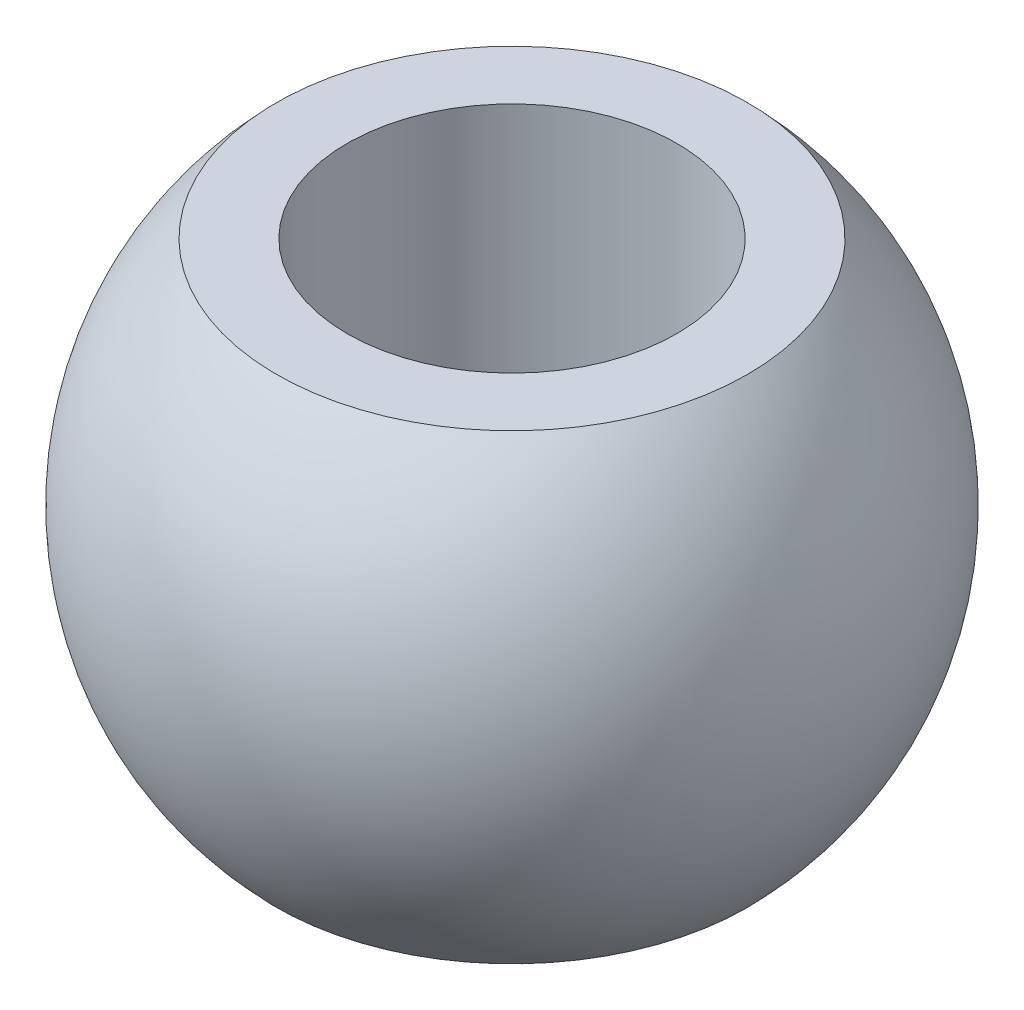
ISO-10303-21;
HEADER;
FILE_DESCRIPTION(('STEP AP214'),'2;1');
FILE_NAME('part.step','',(''),(''),'','','');
FILE_SCHEMA(('AUTOMOTIVE_DESIGN { 1 0 10303 214 1 1 1 1 }'));
ENDSEC;
DATA;
#1=APPLICATION_CONTEXT('core data for automotive mechanical design processes');
#2=APPLICATION_PROTOCOL_DEFINITION('international standard','automotive_design',2000,#1);
#3=PRODUCT_CONTEXT('',#1,'mechanical');
#4=PRODUCT('Part','Part','',(#3));
#5=PRODUCT_RELATED_PRODUCT_CATEGORY('part','',(#4));
#6=PRODUCT_DEFINITION_FORMATION('','',#4);
#7=PRODUCT_DEFINITION_CONTEXT('part definition',#1,'design');
#8=PRODUCT_DEFINITION('design','',#6,#7);
#9=PRODUCT_DEFINITION_SHAPE('','',#8);
#10=(LENGTH_UNIT() NAMED_UNIT(*) SI_UNIT(.MILLI.,.METRE.));
#11=(NAMED_UNIT(*) PLANE_ANGLE_UNIT() SI_UNIT($,.RADIAN.));
#12=(NAMED_UNIT(*) SI_UNIT($,.STERADIAN.) SOLID_ANGLE_UNIT());
#13=UNCERTAINTY_MEASURE_WITH_UNIT(LENGTH_MEASURE(1.E-05),#10,'distance_accuracy_value','');
#14=(GEOMETRIC_REPRESENTATION_CONTEXT(3) GLOBAL_UNCERTAINTY_ASSIGNED_CONTEXT((#13)) GLOBAL_UNIT_ASSIGNED_CONTEXT((#10,
#11,#12)) REPRESENTATION_CONTEXT('',''));
#15=CARTESIAN_POINT('',(0.,0.,0.));
#16=DIRECTION('',(0.,0.,1.));
#17=DIRECTION('',(1.,0.,0.));
#18=AXIS2_PLACEMENT_3D('',#15,#16,#17);
#19=CARTESIAN_POINT('',(5.,7.,0.));
#20=DIRECTION('',(0.,-1.,0.));
#21=DIRECTION('',(0.,0.,-1.));
#22=AXIS2_PLACEMENT_3D('',#19,#20,#21);
#23=PLANE('',#22);
#24=CARTESIAN_POINT('',(0.,7.,0.));
#25=DIRECTION('',(0.,1.,0.));
#26=DIRECTION('',(0.,0.,1.));
#27=AXIS2_PLACEMENT_3D('',#24,#25,#26);
#28=CIRCLE('',#27,5.);
#29=CARTESIAN_POINT('',(0.,7.,5.));
#30=VERTEX_POINT('',#29);
#31=EDGE_CURVE('E48',#30,#30,#28,.T.);
#32=ORIENTED_EDGE('',*,*,#31,.F.);
#33=EDGE_LOOP('',(#32));
#34=FACE_BOUND('',#33,.T.);
#35=CARTESIAN_POINT('',(0.,7.,0.));
#36=DIRECTION('',(0.,1.,0.));
#37=DIRECTION('',(0.,0.,1.));
#38=AXIS2_PLACEMENT_3D('',#35,#36,#37);
#39=CIRCLE('',#38,7.14142842854285);
#40=CARTESIAN_POINT('',(7.14142842854285,7.,0.));
#41=VERTEX_POINT('',#40);
#42=EDGE_CURVE('E10',#41,#41,#39,.T.);
#43=ORIENTED_EDGE('',*,*,#42,.T.);
#44=EDGE_LOOP('',(#43));
#45=FACE_BOUND('',#44,.T.);
#46=ADVANCED_FACE('F34',(#34,#45),#23,.F.);
#47=CARTESIAN_POINT('',(0.,0.,0.));
#48=DIRECTION('',(0.,1.,0.));
#49=DIRECTION('',(1.,0.,0.));
#50=AXIS2_PLACEMENT_3D('',#47,#48,#49);
#51=SPHERICAL_SURFACE('',#50,10.);
#52=CARTESIAN_POINT('',(0.,-7.,0.));
#53=DIRECTION('',(0.,1.,0.));
#54=DIRECTION('',(0.,0.,1.));
#55=AXIS2_PLACEMENT_3D('',#52,#53,#54);
#56=CIRCLE('',#55,7.14142842854285);
#57=CARTESIAN_POINT('',(7.14142842854285,-7.,0.));
#58=VERTEX_POINT('',#57);
#59=EDGE_CURVE('E40',#58,#58,#56,.T.);
#60=CARTESIAN_POINT('',(7.14142842854285,7.,0.));
#61=CARTESIAN_POINT('',(7.2545096935428,6.88463874499006,0.));
#62=CARTESIAN_POINT('',(7.36479074700284,6.76653312155791,0.));
#63=CARTESIAN_POINT('',(7.57950430662305,6.52512009954942,0.));
#64=CARTESIAN_POINT('',(7.68393681278322,6.40181270097309,0.));
#65=CARTESIAN_POINT('',(7.88670515358361,6.15028309037651,0.));
#66=CARTESIAN_POINT('',(7.98504098822383,6.02206087835626,0.));
#67=CARTESIAN_POINT('',(8.17538585739773,5.76100341610101,0.));
#68=CARTESIAN_POINT('',(8.2673948919314,5.62816816586601,0.));
#69=CARTESIAN_POINT('',(8.4448699025128,5.35819635750483,0.));
#70=CARTESIAN_POINT('',(8.53033587856052,5.22105979937865,0.));
#71=CARTESIAN_POINT('',(8.69452414200003,4.94280744060903,0.));
#72=CARTESIAN_POINT('',(8.77324642939181,4.80169163996559,0.));
#73=CARTESIAN_POINT('',(8.92376244967694,4.51581214238739,0.));
#74=CARTESIAN_POINT('',(8.9955561825703,4.37104844545263,0.));
#75=CARTESIAN_POINT('',(9.13204651619452,4.07821308415661,0.));
#76=CARTESIAN_POINT('',(9.19674311692538,3.93014141979535,0.));
#77=CARTESIAN_POINT('',(9.31888726853158,3.63103781555829,0.));
#78=CARTESIAN_POINT('',(9.37633481940692,3.4800058756825,0.));
#79=CARTESIAN_POINT('',(9.48384597674846,3.17533636467838,0.));
#80=CARTESIAN_POINT('',(9.53390958321466,3.02169879355005,0.));
#81=CARTESIAN_POINT('',(9.6265352953481,2.71217878236296,0.));
#82=CARTESIAN_POINT('',(9.66909740101534,2.5562963423042,0.));
#83=CARTESIAN_POINT('',(9.74662016982627,2.24265262692985,0.));
#84=CARTESIAN_POINT('',(9.78158083296996,2.08489135161427,0.));
#85=CARTESIAN_POINT('',(9.84381862422758,1.76786041114315,0.));
#86=CARTESIAN_POINT('',(9.87109575234149,1.60859074598762,0.));
#87=CARTESIAN_POINT('',(9.91790242304949,1.28891701316892,0.));
#88=CARTESIAN_POINT('',(9.93743196564357,1.12851294550575,0.));
#89=CARTESIAN_POINT('',(9.96869760722859,0.806947058737312,0.));
#90=CARTESIAN_POINT('',(9.98043370621952,0.64578523963204,0.));
#91=CARTESIAN_POINT('',(9.99608490260523,0.323082280351178,0.));
#92=CARTESIAN_POINT('',(10.,0.161541140175588,0.));
#93=CARTESIAN_POINT('',(10.,-0.161541140175591,0.));
#94=CARTESIAN_POINT('',(9.99608490260523,-0.32308228035118,0.));
#95=CARTESIAN_POINT('',(9.98043370621952,-0.645785239632042,0.));
#96=CARTESIAN_POINT('',(9.96869760722859,-0.806947058737314,0.));
#97=CARTESIAN_POINT('',(9.93743196564357,-1.12851294550576,0.));
#98=CARTESIAN_POINT('',(9.91790242304949,-1.28891701316893,0.));
#99=CARTESIAN_POINT('',(9.87109575234149,-1.60859074598762,0.));
#100=CARTESIAN_POINT('',(9.84381862422758,-1.76786041114315,0.));
#101=CARTESIAN_POINT('',(9.78158083296996,-2.08489135161427,0.));
#102=CARTESIAN_POINT('',(9.74662016982627,-2.24265262692985,0.));
#103=CARTESIAN_POINT('',(9.66909740101534,-2.5562963423042,0.));
#104=CARTESIAN_POINT('',(9.6265352953481,-2.71217878236296,0.));
#105=CARTESIAN_POINT('',(9.53390958321466,-3.02169879355005,0.));
#106=CARTESIAN_POINT('',(9.48384597674846,-3.17533636467838,0.));
#107=CARTESIAN_POINT('',(9.37633481940692,-3.4800058756825,0.));
#108=CARTESIAN_POINT('',(9.31888726853158,-3.63103781555829,0.));
#109=CARTESIAN_POINT('',(9.19674311692538,-3.93014141979535,0.));
#110=CARTESIAN_POINT('',(9.13204651619452,-4.07821308415661,0.));
#111=CARTESIAN_POINT('',(8.9955561825703,-4.37104844545263,0.));
#112=CARTESIAN_POINT('',(8.92376244967694,-4.51581214238739,0.));
#113=CARTESIAN_POINT('',(8.77324642939181,-4.80169163996559,0.));
#114=CARTESIAN_POINT('',(8.69452414200003,-4.94280744060903,0.));
#115=CARTESIAN_POINT('',(8.53033587856052,-5.22105979937865,0.));
#116=CARTESIAN_POINT('',(8.44486990251279,-5.35819635750483,0.));
#117=CARTESIAN_POINT('',(8.26739489193139,-5.62816816586601,0.));
#118=CARTESIAN_POINT('',(8.17538585739773,-5.76100341610102,0.));
#119=CARTESIAN_POINT('',(7.98504098822383,-6.02206087835627,0.));
#120=CARTESIAN_POINT('',(7.88670515358361,-6.15028309037651,0.));
#121=CARTESIAN_POINT('',(7.68393681278322,-6.40181270097309,0.));
#122=CARTESIAN_POINT('',(7.57950430662305,-6.52512009954942,0.));
#123=CARTESIAN_POINT('',(7.36479074700284,-6.76653312155791,0.));
#124=CARTESIAN_POINT('',(7.2545096935428,-6.88463874499006,0.));
#125=CARTESIAN_POINT('',(7.14142842854285,-7.,0.));
#126=B_SPLINE_CURVE_WITH_KNOTS('',3,(#60,#61,#62,#63,#64,#65,#66,#67,#68,#69,#70,#71,#72,#73,
#74,#75,#76,#77,#78,#79,#80,#81,#82,#83,#84,#85,#86,#87,#88,#89,#90,#91,#92,#93,#94,#95,#96,#97,
#98,#99,#100,#101,#102,#103,#104,#105,#106,#107,#108,#109,#110,#111,#112,#113,#114,#115,#116,
#117,#118,#119,#120,#121,#122,#123,#124,#125),.UNSPECIFIED.,.F.,.F.,(4,2,2,2,2,2,2,2,2,2,2,2,2,
2,2,2,2,2,2,2,2,2,2,2,2,2,2,2,2,2,2,2,4),(0.,0.4845760123577,0.9691520247154,1.4537280370731,
1.9383040494308,2.4228800617885,2.9074560741462,3.3920320865039,3.8766080988616,4.3611841112193,
4.845760123577,5.3303361359347,5.8149121482924,6.2994881606501,6.7840641730078,7.2686401853655,
7.7532161977232,8.2377922100809,8.7223682224386,9.2069442347963,9.691520247154,10.1760962595117,
10.6606722718694,11.1452482842271,11.6298242965848,12.1144003089425,12.5989763213002,
13.0835523336579,13.5681283460156,14.0527043583733,14.537280370731,15.0218563830887,
15.5064323954464),.UNSPECIFIED.);
#127=EDGE_CURVE('BSEAM57',#41,#58,#126,.T.);
#128=ORIENTED_EDGE('',*,*,#42,.F.);
#129=ORIENTED_EDGE('',*,*,#59,.T.);
#130=ORIENTED_EDGE('',*,*,#127,.T.);
#131=ORIENTED_EDGE('',*,*,#127,.F.);
#132=EDGE_LOOP('',(#128,#130,#129,#131));
#133=FACE_BOUND('',#132,.T.);
#134=ADVANCED_FACE('F57',(#133),#51,.T.);
#135=CARTESIAN_POINT('',(5.,-7.,0.));
#136=DIRECTION('',(0.,1.,0.));
#137=DIRECTION('',(0.,0.,1.));
#138=AXIS2_PLACEMENT_3D('',#135,#136,#137);
#139=PLANE('',#138);
#140=ORIENTED_EDGE('',*,*,#59,.F.);
#141=EDGE_LOOP('',(#140));
#142=FACE_BOUND('',#141,.T.);
#143=CARTESIAN_POINT('',(0.,-7.,0.));
#144=DIRECTION('',(0.,1.,0.));
#145=DIRECTION('',(0.,0.,1.));
#146=AXIS2_PLACEMENT_3D('',#143,#144,#145);
#147=CIRCLE('',#146,5.);
#148=CARTESIAN_POINT('',(0.,-7.,5.));
#149=VERTEX_POINT('',#148);
#150=EDGE_CURVE('E44',#149,#149,#147,.T.);
#151=ORIENTED_EDGE('',*,*,#150,.T.);
#152=EDGE_LOOP('',(#151));
#153=FACE_BOUND('',#152,.T.);
#154=ADVANCED_FACE('F61',(#142,#153),#139,.F.);
#155=CARTESIAN_POINT('',(0.,29.8368765160004,0.));
#156=DIRECTION('',(0.,1.,0.));
#157=DIRECTION('',(0.,0.,1.));
#158=AXIS2_PLACEMENT_3D('',#155,#156,#157);
#159=CYLINDRICAL_SURFACE('',#158,5.);
#160=ORIENTED_EDGE('',*,*,#150,.F.);
#161=EDGE_LOOP('',(#160));
#162=FACE_BOUND('',#161,.T.);
#163=ORIENTED_EDGE('',*,*,#31,.T.);
#164=EDGE_LOOP('',(#163));
#165=FACE_BOUND('',#164,.T.);
#166=ADVANCED_FACE('F54',(#162,#165),#159,.F.);
#167=CLOSED_SHELL('',(#46,#134,#154,#166));
#168=MANIFOLD_SOLID_BREP('B2',#167);
#169=ADVANCED_BREP_SHAPE_REPRESENTATION('',(#18,#168),#14);
#170=SHAPE_DEFINITION_REPRESENTATION(#9,#169);
ENDSEC;
END-ISO-10303-21;
